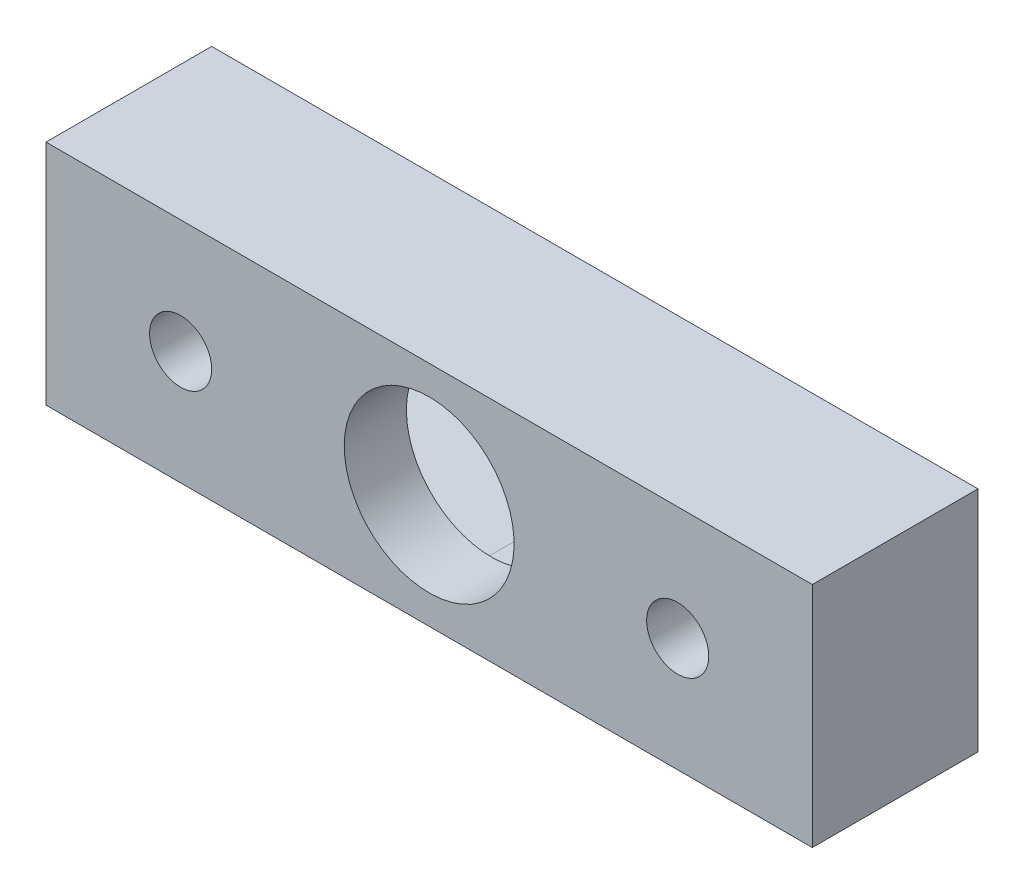
ISO-10303-21;
HEADER;
FILE_DESCRIPTION(('STEP AP214'),'2;1');
FILE_NAME('part.step','',(''),(''),'','','');
FILE_SCHEMA(('AUTOMOTIVE_DESIGN { 1 0 10303 214 1 1 1 1 }'));
ENDSEC;
DATA;
#1=APPLICATION_CONTEXT('core data for automotive mechanical design processes');
#2=APPLICATION_PROTOCOL_DEFINITION('international standard','automotive_design',2000,#1);
#3=PRODUCT_CONTEXT('',#1,'mechanical');
#4=PRODUCT('Part','Part','',(#3));
#5=PRODUCT_RELATED_PRODUCT_CATEGORY('part','',(#4));
#6=PRODUCT_DEFINITION_FORMATION('','',#4);
#7=PRODUCT_DEFINITION_CONTEXT('part definition',#1,'design');
#8=PRODUCT_DEFINITION('design','',#6,#7);
#9=PRODUCT_DEFINITION_SHAPE('','',#8);
#10=(LENGTH_UNIT() NAMED_UNIT(*) SI_UNIT(.MILLI.,.METRE.));
#11=(NAMED_UNIT(*) PLANE_ANGLE_UNIT() SI_UNIT($,.RADIAN.));
#12=(NAMED_UNIT(*) SI_UNIT($,.STERADIAN.) SOLID_ANGLE_UNIT());
#13=UNCERTAINTY_MEASURE_WITH_UNIT(LENGTH_MEASURE(1.E-05),#10,'distance_accuracy_value','');
#14=(GEOMETRIC_REPRESENTATION_CONTEXT(3) GLOBAL_UNCERTAINTY_ASSIGNED_CONTEXT((#13)) GLOBAL_UNIT_ASSIGNED_CONTEXT((#10,
#11,#12)) REPRESENTATION_CONTEXT('',''));
#15=CARTESIAN_POINT('',(0.,0.,0.));
#16=DIRECTION('',(0.,0.,1.));
#17=DIRECTION('',(1.,0.,0.));
#18=AXIS2_PLACEMENT_3D('',#15,#16,#17);
#19=CARTESIAN_POINT('',(0.,0.,0.));
#20=DIRECTION('',(0.,0.,-1.));
#21=DIRECTION('',(-1.,0.,0.));
#22=AXIS2_PLACEMENT_3D('',#19,#20,#21);
#23=PLANE('',#22);
#24=DIRECTION('',(0.,-1.,0.));
#25=VECTOR('',#24,1.);
#26=CARTESIAN_POINT('',(0.,0.,0.));
#27=LINE('',#26,#25);
#28=CARTESIAN_POINT('',(0.,11.,0.));
#29=VERTEX_POINT('',#28);
#30=CARTESIAN_POINT('',(0.,0.,0.));
#31=VERTEX_POINT('',#30);
#32=EDGE_CURVE('E221',#29,#31,#27,.T.);
#33=ORIENTED_EDGE('',*,*,#32,.F.);
#34=DIRECTION('',(-1.,0.,0.));
#35=VECTOR('',#34,1.);
#36=CARTESIAN_POINT('',(0.,11.,0.));
#37=LINE('',#36,#35);
#38=CARTESIAN_POINT('',(37.,11.,0.));
#39=VERTEX_POINT('',#38);
#40=EDGE_CURVE('E82',#39,#29,#37,.T.);
#41=ORIENTED_EDGE('',*,*,#40,.F.);
#42=DIRECTION('',(0.,1.,0.));
#43=VECTOR('',#42,1.);
#44=CARTESIAN_POINT('',(37.,0.,0.));
#45=LINE('',#44,#43);
#46=CARTESIAN_POINT('',(37.,0.,0.));
#47=VERTEX_POINT('',#46);
#48=EDGE_CURVE('E226',#47,#39,#45,.T.);
#49=ORIENTED_EDGE('',*,*,#48,.F.);
#50=DIRECTION('',(1.,0.,0.));
#51=VECTOR('',#50,1.);
#52=CARTESIAN_POINT('',(0.,0.,0.));
#53=LINE('',#52,#51);
#54=EDGE_CURVE('E224',#31,#47,#53,.T.);
#55=ORIENTED_EDGE('',*,*,#54,.F.);
#56=EDGE_LOOP('',(#33,#41,#49,#55));
#57=FACE_BOUND('',#56,.T.);
#58=DIRECTION('',(0.990441835610005,-0.137931034482759,0.));
#59=VECTOR('',#58,1.);
#60=CARTESIAN_POINT('',(19.148275862069,10.155076627367,0.));
#61=LINE('',#60,#59);
#62=CARTESIAN_POINT('',(19.148275862069,10.155076627367,0.));
#63=VERTEX_POINT('',#62);
#64=CARTESIAN_POINT('',(33.3724137931034,8.17419295614701,0.));
#65=VERTEX_POINT('',#64);
#66=EDGE_CURVE('E148',#63,#65,#61,.T.);
#67=ORIENTED_EDGE('',*,*,#66,.F.);
#68=CARTESIAN_POINT('',(18.5,5.5,0.));
#69=DIRECTION('',(0.,0.,-1.));
#70=DIRECTION('',(-1.,0.,0.));
#71=AXIS2_PLACEMENT_3D('',#68,#69,#70);
#72=CIRCLE('',#71,4.7);
#73=CARTESIAN_POINT('',(17.851724137931,10.155076627367,0.));
#74=VERTEX_POINT('',#73);
#75=EDGE_CURVE('E137',#74,#63,#72,.T.);
#76=ORIENTED_EDGE('',*,*,#75,.F.);
#77=DIRECTION('',(0.990441835610005,0.137931034482759,0.));
#78=VECTOR('',#77,1.);
#79=CARTESIAN_POINT('',(3.62758620689655,8.17419295614701,0.));
#80=LINE('',#79,#78);
#81=CARTESIAN_POINT('',(3.62758620689655,8.17419295614701,0.));
#82=VERTEX_POINT('',#81);
#83=EDGE_CURVE('E174',#82,#74,#80,.T.);
#84=ORIENTED_EDGE('',*,*,#83,.F.);
#85=CARTESIAN_POINT('',(4.,5.5,0.));
#86=DIRECTION('',(0.,0.,-1.));
#87=DIRECTION('',(-1.,0.,0.));
#88=AXIS2_PLACEMENT_3D('',#85,#86,#87);
#89=CIRCLE('',#88,2.7);
#90=CARTESIAN_POINT('',(3.62758620689655,2.82580704385299,0.));
#91=VERTEX_POINT('',#90);
#92=EDGE_CURVE('E172',#91,#82,#89,.T.);
#93=ORIENTED_EDGE('',*,*,#92,.F.);
#94=DIRECTION('',(-0.990441835610005,0.137931034482758,0.));
#95=VECTOR('',#94,1.);
#96=CARTESIAN_POINT('',(17.851724137931,0.844923372632978,0.));
#97=LINE('',#96,#95);
#98=CARTESIAN_POINT('',(17.851724137931,0.844923372632978,0.));
#99=VERTEX_POINT('',#98);
#100=EDGE_CURVE('E170',#99,#91,#97,.T.);
#101=ORIENTED_EDGE('',*,*,#100,.F.);
#102=CARTESIAN_POINT('',(18.5,5.5,0.));
#103=DIRECTION('',(0.,0.,-1.));
#104=DIRECTION('',(-1.,0.,0.));
#105=AXIS2_PLACEMENT_3D('',#102,#103,#104);
#106=CIRCLE('',#105,4.7);
#107=CARTESIAN_POINT('',(19.148275862069,0.844923372632977,0.));
#108=VERTEX_POINT('',#107);
#109=EDGE_CURVE('E168',#108,#99,#106,.T.);
#110=ORIENTED_EDGE('',*,*,#109,.F.);
#111=DIRECTION('',(-0.990441835610005,-0.137931034482759,0.));
#112=VECTOR('',#111,1.);
#113=CARTESIAN_POINT('',(33.3724137931034,2.82580704385298,0.));
#114=LINE('',#113,#112);
#115=CARTESIAN_POINT('',(33.3724137931034,2.82580704385298,0.));
#116=VERTEX_POINT('',#115);
#117=EDGE_CURVE('E163',#116,#108,#114,.T.);
#118=ORIENTED_EDGE('',*,*,#117,.F.);
#119=CARTESIAN_POINT('',(33.,5.5,0.));
#120=DIRECTION('',(0.,0.,-1.));
#121=DIRECTION('',(-1.,0.,0.));
#122=AXIS2_PLACEMENT_3D('',#119,#120,#121);
#123=CIRCLE('',#122,2.7);
#124=EDGE_CURVE('E161',#65,#116,#123,.T.);
#125=ORIENTED_EDGE('',*,*,#124,.F.);
#126=EDGE_LOOP('',(#67,#76,#84,#93,#101,#110,#118,#125));
#127=FACE_BOUND('',#126,.T.);
#128=ADVANCED_FACE('F35',(#57,#127),#23,.T.);
#129=CARTESIAN_POINT('',(18.5,5.5,5.));
#130=DIRECTION('',(0.,0.,-1.));
#131=DIRECTION('',(-1.,0.,0.));
#132=AXIS2_PLACEMENT_3D('',#129,#130,#131);
#133=PLANE('',#132);
#134=CARTESIAN_POINT('',(18.5,5.5,5.));
#135=DIRECTION('',(0.,0.,-1.));
#136=DIRECTION('',(-1.,0.,0.));
#137=AXIS2_PLACEMENT_3D('',#134,#135,#136);
#138=CIRCLE('',#137,4.1);
#139=CARTESIAN_POINT('',(14.4,5.5,5.));
#140=VERTEX_POINT('',#139);
#141=EDGE_CURVE('E438',#140,#140,#138,.T.);
#142=ORIENTED_EDGE('',*,*,#141,.F.);
#143=EDGE_LOOP('',(#142));
#144=FACE_BOUND('',#143,.T.);
#145=CARTESIAN_POINT('',(6.5,5.5,5.));
#146=DIRECTION('',(0.,0.,-1.));
#147=DIRECTION('',(-1.,0.,0.));
#148=AXIS2_PLACEMENT_3D('',#145,#146,#147);
#149=CIRCLE('',#148,1.5);
#150=CARTESIAN_POINT('',(5.,5.5,5.));
#151=VERTEX_POINT('',#150);
#152=EDGE_CURVE('E207',#151,#151,#149,.T.);
#153=ORIENTED_EDGE('',*,*,#152,.F.);
#154=EDGE_LOOP('',(#153));
#155=FACE_BOUND('',#154,.T.);
#156=CARTESIAN_POINT('',(30.5,5.5,5.));
#157=DIRECTION('',(0.,0.,-1.));
#158=DIRECTION('',(-1.,0.,0.));
#159=AXIS2_PLACEMENT_3D('',#156,#157,#158);
#160=CIRCLE('',#159,1.5);
#161=CARTESIAN_POINT('',(29.,5.5,5.));
#162=VERTEX_POINT('',#161);
#163=EDGE_CURVE('E213',#162,#162,#160,.T.);
#164=ORIENTED_EDGE('',*,*,#163,.F.);
#165=EDGE_LOOP('',(#164));
#166=FACE_BOUND('',#165,.T.);
#167=CARTESIAN_POINT('',(18.5,5.5,5.));
#168=DIRECTION('',(0.,0.,-1.));
#169=DIRECTION('',(-1.,0.,0.));
#170=AXIS2_PLACEMENT_3D('',#167,#168,#169);
#171=CIRCLE('',#170,4.7);
#172=CARTESIAN_POINT('',(17.851724137931,10.155076627367,5.));
#173=VERTEX_POINT('',#172);
#174=CARTESIAN_POINT('',(19.148275862069,10.155076627367,5.));
#175=VERTEX_POINT('',#174);
#176=EDGE_CURVE('E176',#173,#175,#171,.T.);
#177=ORIENTED_EDGE('',*,*,#176,.T.);
#178=DIRECTION('',(0.990441835610005,-0.137931034482759,0.));
#179=VECTOR('',#178,1.);
#180=CARTESIAN_POINT('',(19.148275862069,10.155076627367,5.));
#181=LINE('',#180,#179);
#182=CARTESIAN_POINT('',(33.3724137931034,8.17419295614701,5.));
#183=VERTEX_POINT('',#182);
#184=EDGE_CURVE('E155',#175,#183,#181,.T.);
#185=ORIENTED_EDGE('',*,*,#184,.T.);
#186=CARTESIAN_POINT('',(33.,5.5,5.));
#187=DIRECTION('',(0.,0.,-1.));
#188=DIRECTION('',(-1.,0.,0.));
#189=AXIS2_PLACEMENT_3D('',#186,#187,#188);
#190=CIRCLE('',#189,2.7);
#191=CARTESIAN_POINT('',(33.3724137931034,2.82580704385298,5.));
#192=VERTEX_POINT('',#191);
#193=EDGE_CURVE('E179',#183,#192,#190,.T.);
#194=ORIENTED_EDGE('',*,*,#193,.T.);
#195=DIRECTION('',(-0.990441835610005,-0.137931034482759,0.));
#196=VECTOR('',#195,1.);
#197=CARTESIAN_POINT('',(33.3724137931034,2.82580704385298,5.));
#198=LINE('',#197,#196);
#199=CARTESIAN_POINT('',(19.148275862069,0.844923372632977,5.));
#200=VERTEX_POINT('',#199);
#201=EDGE_CURVE('E181',#192,#200,#198,.T.);
#202=ORIENTED_EDGE('',*,*,#201,.T.);
#203=CARTESIAN_POINT('',(18.5,5.5,5.));
#204=DIRECTION('',(0.,0.,-1.));
#205=DIRECTION('',(-1.,0.,0.));
#206=AXIS2_PLACEMENT_3D('',#203,#204,#205);
#207=CIRCLE('',#206,4.7);
#208=CARTESIAN_POINT('',(17.851724137931,0.844923372632978,5.));
#209=VERTEX_POINT('',#208);
#210=EDGE_CURVE('E183',#200,#209,#207,.T.);
#211=ORIENTED_EDGE('',*,*,#210,.T.);
#212=DIRECTION('',(-0.990441835610005,0.137931034482758,0.));
#213=VECTOR('',#212,1.);
#214=CARTESIAN_POINT('',(17.851724137931,0.844923372632978,5.));
#215=LINE('',#214,#213);
#216=CARTESIAN_POINT('',(3.62758620689655,2.82580704385299,5.));
#217=VERTEX_POINT('',#216);
#218=EDGE_CURVE('E185',#209,#217,#215,.T.);
#219=ORIENTED_EDGE('',*,*,#218,.T.);
#220=CARTESIAN_POINT('',(4.,5.5,5.));
#221=DIRECTION('',(0.,0.,-1.));
#222=DIRECTION('',(-1.,0.,0.));
#223=AXIS2_PLACEMENT_3D('',#220,#221,#222);
#224=CIRCLE('',#223,2.7);
#225=CARTESIAN_POINT('',(3.62758620689655,8.17419295614701,5.));
#226=VERTEX_POINT('',#225);
#227=EDGE_CURVE('E187',#217,#226,#224,.T.);
#228=ORIENTED_EDGE('',*,*,#227,.T.);
#229=DIRECTION('',(0.990441835610005,0.137931034482759,0.));
#230=VECTOR('',#229,1.);
#231=CARTESIAN_POINT('',(3.62758620689655,8.17419295614701,5.));
#232=LINE('',#231,#230);
#233=EDGE_CURVE('E149',#226,#173,#232,.T.);
#234=ORIENTED_EDGE('',*,*,#233,.T.);
#235=EDGE_LOOP('',(#177,#185,#194,#202,#211,#219,#228,#234));
#236=FACE_BOUND('',#235,.T.);
#237=ADVANCED_FACE('F239',(#144,#155,#166,#236),#133,.T.);
#238=CARTESIAN_POINT('',(30.5,5.5,8.));
#239=DIRECTION('',(0.,0.,-1.));
#240=DIRECTION('',(-1.,0.,0.));
#241=AXIS2_PLACEMENT_3D('',#238,#239,#240);
#242=CYLINDRICAL_SURFACE('',#241,1.5);
#243=ORIENTED_EDGE('',*,*,#163,.T.);
#244=EDGE_LOOP('',(#243));
#245=FACE_BOUND('',#244,.T.);
#246=CARTESIAN_POINT('',(30.5,5.5,8.));
#247=DIRECTION('',(0.,0.,-1.));
#248=DIRECTION('',(-1.,0.,0.));
#249=AXIS2_PLACEMENT_3D('',#246,#247,#248);
#250=CIRCLE('',#249,1.5);
#251=CARTESIAN_POINT('',(29.,5.5,8.));
#252=VERTEX_POINT('',#251);
#253=EDGE_CURVE('E210',#252,#252,#250,.T.);
#254=ORIENTED_EDGE('',*,*,#253,.F.);
#255=EDGE_LOOP('',(#254));
#256=FACE_BOUND('',#255,.T.);
#257=ADVANCED_FACE('F236',(#245,#256),#242,.F.);
#258=CARTESIAN_POINT('',(0.,0.,8.));
#259=DIRECTION('',(1.,0.,0.));
#260=DIRECTION('',(0.,0.,-1.));
#261=AXIS2_PLACEMENT_3D('',#258,#259,#260);
#262=PLANE('',#261);
#263=ORIENTED_EDGE('',*,*,#32,.T.);
#264=DIRECTION('',(0.,0.,-1.));
#265=VECTOR('',#264,1.);
#266=CARTESIAN_POINT('',(0.,0.,8.));
#267=LINE('',#266,#265);
#268=CARTESIAN_POINT('',(0.,0.,8.));
#269=VERTEX_POINT('',#268);
#270=EDGE_CURVE('E11',#269,#31,#267,.T.);
#271=ORIENTED_EDGE('',*,*,#270,.F.);
#272=DIRECTION('',(0.,-1.,0.));
#273=VECTOR('',#272,1.);
#274=CARTESIAN_POINT('',(0.,0.,8.));
#275=LINE('',#274,#273);
#276=CARTESIAN_POINT('',(0.,11.,8.));
#277=VERTEX_POINT('',#276);
#278=EDGE_CURVE('E214',#277,#269,#275,.T.);
#279=ORIENTED_EDGE('',*,*,#278,.F.);
#280=DIRECTION('',(0.,0.,-1.));
#281=VECTOR('',#280,1.);
#282=CARTESIAN_POINT('',(0.,11.,8.));
#283=LINE('',#282,#281);
#284=EDGE_CURVE('E220',#277,#29,#283,.T.);
#285=ORIENTED_EDGE('',*,*,#284,.T.);
#286=EDGE_LOOP('',(#263,#271,#279,#285));
#287=FACE_BOUND('',#286,.T.);
#288=ADVANCED_FACE('F37',(#287),#262,.F.);
#289=CARTESIAN_POINT('',(0.,0.,8.));
#290=DIRECTION('',(0.,1.,0.));
#291=DIRECTION('',(0.,0.,1.));
#292=AXIS2_PLACEMENT_3D('',#289,#290,#291);
#293=PLANE('',#292);
#294=ORIENTED_EDGE('',*,*,#54,.T.);
#295=DIRECTION('',(0.,0.,-1.));
#296=VECTOR('',#295,1.);
#297=CARTESIAN_POINT('',(37.,0.,8.));
#298=LINE('',#297,#296);
#299=CARTESIAN_POINT('',(37.,0.,8.));
#300=VERTEX_POINT('',#299);
#301=EDGE_CURVE('E44',#300,#47,#298,.T.);
#302=ORIENTED_EDGE('',*,*,#301,.F.);
#303=DIRECTION('',(1.,0.,0.));
#304=VECTOR('',#303,1.);
#305=CARTESIAN_POINT('',(0.,0.,8.));
#306=LINE('',#305,#304);
#307=EDGE_CURVE('E89',#269,#300,#306,.T.);
#308=ORIENTED_EDGE('',*,*,#307,.F.);
#309=ORIENTED_EDGE('',*,*,#270,.T.);
#310=EDGE_LOOP('',(#294,#302,#308,#309));
#311=FACE_BOUND('',#310,.T.);
#312=ADVANCED_FACE('F289',(#311),#293,.F.);
#313=CARTESIAN_POINT('',(37.,0.,8.));
#314=DIRECTION('',(-1.,0.,0.));
#315=DIRECTION('',(0.,0.,1.));
#316=AXIS2_PLACEMENT_3D('',#313,#314,#315);
#317=PLANE('',#316);
#318=ORIENTED_EDGE('',*,*,#48,.T.);
#319=DIRECTION('',(0.,0.,-1.));
#320=VECTOR('',#319,1.);
#321=CARTESIAN_POINT('',(37.,11.,8.));
#322=LINE('',#321,#320);
#323=CARTESIAN_POINT('',(37.,11.,8.));
#324=VERTEX_POINT('',#323);
#325=EDGE_CURVE('E230',#324,#39,#322,.T.);
#326=ORIENTED_EDGE('',*,*,#325,.F.);
#327=DIRECTION('',(0.,1.,0.));
#328=VECTOR('',#327,1.);
#329=CARTESIAN_POINT('',(37.,0.,8.));
#330=LINE('',#329,#328);
#331=EDGE_CURVE('E217',#300,#324,#330,.T.);
#332=ORIENTED_EDGE('',*,*,#331,.F.);
#333=ORIENTED_EDGE('',*,*,#301,.T.);
#334=EDGE_LOOP('',(#318,#326,#332,#333));
#335=FACE_BOUND('',#334,.T.);
#336=ADVANCED_FACE('F287',(#335),#317,.F.);
#337=CARTESIAN_POINT('',(0.,11.,8.));
#338=DIRECTION('',(0.,-1.,0.));
#339=DIRECTION('',(0.,0.,-1.));
#340=AXIS2_PLACEMENT_3D('',#337,#338,#339);
#341=PLANE('',#340);
#342=ORIENTED_EDGE('',*,*,#40,.T.);
#343=ORIENTED_EDGE('',*,*,#284,.F.);
#344=DIRECTION('',(-1.,0.,0.));
#345=VECTOR('',#344,1.);
#346=CARTESIAN_POINT('',(0.,11.,8.));
#347=LINE('',#346,#345);
#348=EDGE_CURVE('E61',#324,#277,#347,.T.);
#349=ORIENTED_EDGE('',*,*,#348,.F.);
#350=ORIENTED_EDGE('',*,*,#325,.T.);
#351=EDGE_LOOP('',(#342,#343,#349,#350));
#352=FACE_BOUND('',#351,.T.);
#353=ADVANCED_FACE('F284',(#352),#341,.F.);
#354=CARTESIAN_POINT('',(0.,0.,8.));
#355=DIRECTION('',(0.,0.,-1.));
#356=DIRECTION('',(-1.,0.,0.));
#357=AXIS2_PLACEMENT_3D('',#354,#355,#356);
#358=PLANE('',#357);
#359=CARTESIAN_POINT('',(18.5,5.5,8.));
#360=DIRECTION('',(0.,0.,-1.));
#361=DIRECTION('',(-1.,0.,0.));
#362=AXIS2_PLACEMENT_3D('',#359,#360,#361);
#363=CIRCLE('',#362,4.1);
#364=CARTESIAN_POINT('',(14.4,5.5,8.));
#365=VERTEX_POINT('',#364);
#366=EDGE_CURVE('E39',#365,#365,#363,.T.);
#367=ORIENTED_EDGE('',*,*,#366,.T.);
#368=EDGE_LOOP('',(#367));
#369=FACE_BOUND('',#368,.T.);
#370=CARTESIAN_POINT('',(6.5,5.5,8.));
#371=DIRECTION('',(0.,0.,-1.));
#372=DIRECTION('',(-1.,0.,0.));
#373=AXIS2_PLACEMENT_3D('',#370,#371,#372);
#374=CIRCLE('',#373,1.5);
#375=CARTESIAN_POINT('',(5.,5.5,8.));
#376=VERTEX_POINT('',#375);
#377=EDGE_CURVE('E156',#376,#376,#374,.T.);
#378=ORIENTED_EDGE('',*,*,#377,.T.);
#379=EDGE_LOOP('',(#378));
#380=FACE_BOUND('',#379,.T.);
#381=ORIENTED_EDGE('',*,*,#253,.T.);
#382=EDGE_LOOP('',(#381));
#383=FACE_BOUND('',#382,.T.);
#384=ORIENTED_EDGE('',*,*,#278,.T.);
#385=ORIENTED_EDGE('',*,*,#307,.T.);
#386=ORIENTED_EDGE('',*,*,#331,.T.);
#387=ORIENTED_EDGE('',*,*,#348,.T.);
#388=EDGE_LOOP('',(#384,#385,#386,#387));
#389=FACE_BOUND('',#388,.T.);
#390=ADVANCED_FACE('F283',(#369,#380,#383,#389),#358,.F.);
#391=CARTESIAN_POINT('',(6.5,5.5,8.));
#392=DIRECTION('',(0.,0.,-1.));
#393=DIRECTION('',(-1.,0.,0.));
#394=AXIS2_PLACEMENT_3D('',#391,#392,#393);
#395=CYLINDRICAL_SURFACE('',#394,1.5);
#396=ORIENTED_EDGE('',*,*,#152,.T.);
#397=EDGE_LOOP('',(#396));
#398=FACE_BOUND('',#397,.T.);
#399=ORIENTED_EDGE('',*,*,#377,.F.);
#400=EDGE_LOOP('',(#399));
#401=FACE_BOUND('',#400,.T.);
#402=ADVANCED_FACE('F302',(#398,#401),#395,.F.);
#403=CARTESIAN_POINT('',(3.62758620689655,8.17419295614701,0.));
#404=DIRECTION('',(0.137931034482759,-0.990441835610005,0.));
#405=DIRECTION('',(0.990441835610005,0.137931034482759,0.));
#406=AXIS2_PLACEMENT_3D('',#403,#404,#405);
#407=PLANE('',#406);
#408=ORIENTED_EDGE('',*,*,#233,.F.);
#409=DIRECTION('',(0.,0.,1.));
#410=VECTOR('',#409,1.);
#411=CARTESIAN_POINT('',(3.62758620689655,8.17419295614701,0.));
#412=LINE('',#411,#410);
#413=EDGE_CURVE('E52',#82,#226,#412,.T.);
#414=ORIENTED_EDGE('',*,*,#413,.F.);
#415=ORIENTED_EDGE('',*,*,#83,.T.);
#416=DIRECTION('',(0.,0.,1.));
#417=VECTOR('',#416,1.);
#418=CARTESIAN_POINT('',(17.851724137931,10.155076627367,0.));
#419=LINE('',#418,#417);
#420=EDGE_CURVE('E144',#74,#173,#419,.T.);
#421=ORIENTED_EDGE('',*,*,#420,.T.);
#422=EDGE_LOOP('',(#408,#414,#415,#421));
#423=FACE_BOUND('',#422,.T.);
#424=ADVANCED_FACE('F245',(#423),#407,.T.);
#425=CARTESIAN_POINT('',(4.,5.5,0.));
#426=DIRECTION('',(0.,0.,1.));
#427=DIRECTION('',(1.,0.,0.));
#428=AXIS2_PLACEMENT_3D('',#425,#426,#427);
#429=CYLINDRICAL_SURFACE('',#428,2.7);
#430=ORIENTED_EDGE('',*,*,#227,.F.);
#431=DIRECTION('',(0.,0.,1.));
#432=VECTOR('',#431,1.);
#433=CARTESIAN_POINT('',(3.62758620689655,2.82580704385299,0.));
#434=LINE('',#433,#432);
#435=EDGE_CURVE('E192',#91,#217,#434,.T.);
#436=ORIENTED_EDGE('',*,*,#435,.F.);
#437=ORIENTED_EDGE('',*,*,#92,.T.);
#438=ORIENTED_EDGE('',*,*,#413,.T.);
#439=EDGE_LOOP('',(#430,#436,#437,#438));
#440=FACE_BOUND('',#439,.T.);
#441=ADVANCED_FACE('F251',(#440),#429,.F.);
#442=CARTESIAN_POINT('',(17.851724137931,0.844923372632978,0.));
#443=DIRECTION('',(0.137931034482758,0.990441835610005,0.));
#444=DIRECTION('',(-0.990441835610005,0.137931034482758,0.));
#445=AXIS2_PLACEMENT_3D('',#442,#443,#444);
#446=PLANE('',#445);
#447=ORIENTED_EDGE('',*,*,#218,.F.);
#448=DIRECTION('',(0.,0.,1.));
#449=VECTOR('',#448,1.);
#450=CARTESIAN_POINT('',(17.851724137931,0.844923372632978,0.));
#451=LINE('',#450,#449);
#452=EDGE_CURVE('E195',#99,#209,#451,.T.);
#453=ORIENTED_EDGE('',*,*,#452,.F.);
#454=ORIENTED_EDGE('',*,*,#100,.T.);
#455=ORIENTED_EDGE('',*,*,#435,.T.);
#456=EDGE_LOOP('',(#447,#453,#454,#455));
#457=FACE_BOUND('',#456,.T.);
#458=ADVANCED_FACE('F254',(#457),#446,.T.);
#459=CARTESIAN_POINT('',(18.5,5.5,0.));
#460=DIRECTION('',(0.,0.,1.));
#461=DIRECTION('',(1.,0.,0.));
#462=AXIS2_PLACEMENT_3D('',#459,#460,#461);
#463=CYLINDRICAL_SURFACE('',#462,4.7);
#464=ORIENTED_EDGE('',*,*,#210,.F.);
#465=DIRECTION('',(0.,0.,1.));
#466=VECTOR('',#465,1.);
#467=CARTESIAN_POINT('',(19.148275862069,0.844923372632977,0.));
#468=LINE('',#467,#466);
#469=EDGE_CURVE('E198',#108,#200,#468,.T.);
#470=ORIENTED_EDGE('',*,*,#469,.F.);
#471=ORIENTED_EDGE('',*,*,#109,.T.);
#472=ORIENTED_EDGE('',*,*,#452,.T.);
#473=EDGE_LOOP('',(#464,#470,#471,#472));
#474=FACE_BOUND('',#473,.T.);
#475=ADVANCED_FACE('F258',(#474),#463,.F.);
#476=CARTESIAN_POINT('',(33.3724137931034,2.82580704385298,0.));
#477=DIRECTION('',(-0.137931034482759,0.990441835610005,0.));
#478=DIRECTION('',(-0.990441835610005,-0.137931034482759,0.));
#479=AXIS2_PLACEMENT_3D('',#476,#477,#478);
#480=PLANE('',#479);
#481=ORIENTED_EDGE('',*,*,#201,.F.);
#482=DIRECTION('',(0.,0.,1.));
#483=VECTOR('',#482,1.);
#484=CARTESIAN_POINT('',(33.3724137931034,2.82580704385298,0.));
#485=LINE('',#484,#483);
#486=EDGE_CURVE('E201',#116,#192,#485,.T.);
#487=ORIENTED_EDGE('',*,*,#486,.F.);
#488=ORIENTED_EDGE('',*,*,#117,.T.);
#489=ORIENTED_EDGE('',*,*,#469,.T.);
#490=EDGE_LOOP('',(#481,#487,#488,#489));
#491=FACE_BOUND('',#490,.T.);
#492=ADVANCED_FACE('F263',(#491),#480,.T.);
#493=CARTESIAN_POINT('',(33.,5.5,0.));
#494=DIRECTION('',(0.,0.,1.));
#495=DIRECTION('',(1.,0.,0.));
#496=AXIS2_PLACEMENT_3D('',#493,#494,#495);
#497=CYLINDRICAL_SURFACE('',#496,2.7);
#498=ORIENTED_EDGE('',*,*,#193,.F.);
#499=DIRECTION('',(0.,0.,1.));
#500=VECTOR('',#499,1.);
#501=CARTESIAN_POINT('',(33.3724137931034,8.17419295614701,0.));
#502=LINE('',#501,#500);
#503=EDGE_CURVE('E157',#65,#183,#502,.T.);
#504=ORIENTED_EDGE('',*,*,#503,.F.);
#505=ORIENTED_EDGE('',*,*,#124,.T.);
#506=ORIENTED_EDGE('',*,*,#486,.T.);
#507=EDGE_LOOP('',(#498,#504,#505,#506));
#508=FACE_BOUND('',#507,.T.);
#509=ADVANCED_FACE('F266',(#508),#497,.F.);
#510=CARTESIAN_POINT('',(19.148275862069,10.155076627367,0.));
#511=DIRECTION('',(-0.137931034482759,-0.990441835610005,0.));
#512=DIRECTION('',(0.990441835610005,-0.137931034482759,0.));
#513=AXIS2_PLACEMENT_3D('',#510,#511,#512);
#514=PLANE('',#513);
#515=ORIENTED_EDGE('',*,*,#184,.F.);
#516=DIRECTION('',(0.,0.,1.));
#517=VECTOR('',#516,1.);
#518=CARTESIAN_POINT('',(19.148275862069,10.155076627367,0.));
#519=LINE('',#518,#517);
#520=EDGE_CURVE('E141',#63,#175,#519,.T.);
#521=ORIENTED_EDGE('',*,*,#520,.F.);
#522=ORIENTED_EDGE('',*,*,#66,.T.);
#523=ORIENTED_EDGE('',*,*,#503,.T.);
#524=EDGE_LOOP('',(#515,#521,#522,#523));
#525=FACE_BOUND('',#524,.T.);
#526=ADVANCED_FACE('F152',(#525),#514,.T.);
#527=CARTESIAN_POINT('',(18.5,5.5,0.));
#528=DIRECTION('',(0.,0.,1.));
#529=DIRECTION('',(1.,0.,0.));
#530=AXIS2_PLACEMENT_3D('',#527,#528,#529);
#531=CYLINDRICAL_SURFACE('',#530,4.7);
#532=ORIENTED_EDGE('',*,*,#176,.F.);
#533=ORIENTED_EDGE('',*,*,#420,.F.);
#534=ORIENTED_EDGE('',*,*,#75,.T.);
#535=ORIENTED_EDGE('',*,*,#520,.T.);
#536=EDGE_LOOP('',(#532,#533,#534,#535));
#537=FACE_BOUND('',#536,.T.);
#538=ADVANCED_FACE('F140',(#537),#531,.F.);
#539=CARTESIAN_POINT('',(18.5,5.5,13.));
#540=DIRECTION('',(0.,0.,-1.));
#541=DIRECTION('',(-1.,0.,0.));
#542=AXIS2_PLACEMENT_3D('',#539,#540,#541);
#543=CYLINDRICAL_SURFACE('',#542,4.1);
#544=ORIENTED_EDGE('',*,*,#141,.T.);
#545=EDGE_LOOP('',(#544));
#546=FACE_BOUND('',#545,.T.);
#547=ORIENTED_EDGE('',*,*,#366,.F.);
#548=EDGE_LOOP('',(#547));
#549=FACE_BOUND('',#548,.T.);
#550=ADVANCED_FACE('F321',(#546,#549),#543,.F.);
#551=CLOSED_SHELL('',(#128,#237,#257,#288,#312,#336,#353,#390,#402,#424,#441,#458,#475,#492,
#509,#526,#538,#550));
#552=MANIFOLD_SOLID_BREP('B2',#551);
#553=ADVANCED_BREP_SHAPE_REPRESENTATION('',(#18,#552),#14);
#554=SHAPE_DEFINITION_REPRESENTATION(#9,#553);
ENDSEC;
END-ISO-10303-21;
